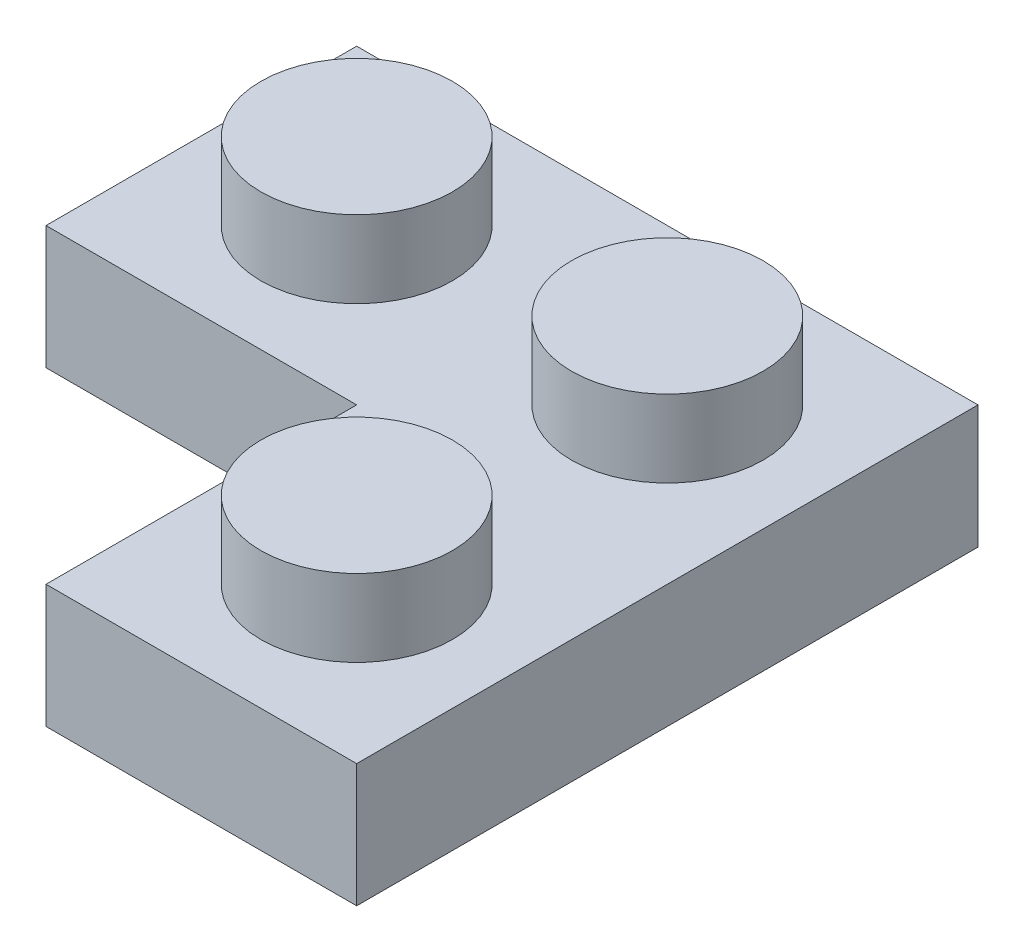
ISO-10303-21;
HEADER;
FILE_DESCRIPTION(('STEP AP214'),'2;1');
FILE_NAME('part.step','',(''),(''),'','','');
FILE_SCHEMA(('AUTOMOTIVE_DESIGN { 1 0 10303 214 1 1 1 1 }'));
ENDSEC;
DATA;
#1=APPLICATION_CONTEXT('core data for automotive mechanical design processes');
#2=APPLICATION_PROTOCOL_DEFINITION('international standard','automotive_design',2000,#1);
#3=PRODUCT_CONTEXT('',#1,'mechanical');
#4=PRODUCT('Part','Part','',(#3));
#5=PRODUCT_RELATED_PRODUCT_CATEGORY('part','',(#4));
#6=PRODUCT_DEFINITION_FORMATION('','',#4);
#7=PRODUCT_DEFINITION_CONTEXT('part definition',#1,'design');
#8=PRODUCT_DEFINITION('design','',#6,#7);
#9=PRODUCT_DEFINITION_SHAPE('','',#8);
#10=(LENGTH_UNIT() NAMED_UNIT(*) SI_UNIT(.MILLI.,.METRE.));
#11=(NAMED_UNIT(*) PLANE_ANGLE_UNIT() SI_UNIT($,.RADIAN.));
#12=(NAMED_UNIT(*) SI_UNIT($,.STERADIAN.) SOLID_ANGLE_UNIT());
#13=UNCERTAINTY_MEASURE_WITH_UNIT(LENGTH_MEASURE(1.E-05),#10,'distance_accuracy_value','');
#14=(GEOMETRIC_REPRESENTATION_CONTEXT(3) GLOBAL_UNCERTAINTY_ASSIGNED_CONTEXT((#13)) GLOBAL_UNIT_ASSIGNED_CONTEXT((#10,
#11,#12)) REPRESENTATION_CONTEXT('',''));
#15=CARTESIAN_POINT('',(0.,0.,0.));
#16=DIRECTION('',(0.,0.,1.));
#17=DIRECTION('',(1.,0.,0.));
#18=AXIS2_PLACEMENT_3D('',#15,#16,#17);
#19=CARTESIAN_POINT('',(0.,-3.15,0.));
#20=DIRECTION('',(0.,-1.,0.));
#21=DIRECTION('',(0.,0.,-1.));
#22=AXIS2_PLACEMENT_3D('',#19,#20,#21);
#23=PLANE('',#22);
#24=DIRECTION('',(1.,0.,0.));
#25=VECTOR('',#24,1.);
#26=CARTESIAN_POINT('',(-7.945,-3.15,0.));
#27=LINE('',#26,#25);
#28=CARTESIAN_POINT('',(-7.945,-3.15,0.));
#29=VERTEX_POINT('',#28);
#30=CARTESIAN_POINT('',(0.,-3.15,0.));
#31=VERTEX_POINT('',#30);
#32=EDGE_CURVE('E152',#29,#31,#27,.T.);
#33=ORIENTED_EDGE('',*,*,#32,.F.);
#34=DIRECTION('',(0.,0.,1.));
#35=VECTOR('',#34,1.);
#36=CARTESIAN_POINT('',(-7.945,-3.15,-7.945));
#37=LINE('',#36,#35);
#38=CARTESIAN_POINT('',(-7.945,-3.15,-7.945));
#39=VERTEX_POINT('',#38);
#40=EDGE_CURVE('E126',#39,#29,#37,.T.);
#41=ORIENTED_EDGE('',*,*,#40,.F.);
#42=DIRECTION('',(-1.,0.,0.));
#43=VECTOR('',#42,1.);
#44=CARTESIAN_POINT('',(7.945,-3.15,-7.945));
#45=LINE('',#44,#43);
#46=CARTESIAN_POINT('',(7.945,-3.15,-7.945));
#47=VERTEX_POINT('',#46);
#48=EDGE_CURVE('E109',#47,#39,#45,.T.);
#49=ORIENTED_EDGE('',*,*,#48,.F.);
#50=DIRECTION('',(0.,0.,-1.));
#51=VECTOR('',#50,1.);
#52=CARTESIAN_POINT('',(7.945,-3.15,7.945));
#53=LINE('',#52,#51);
#54=CARTESIAN_POINT('',(7.945,-3.15,7.945));
#55=VERTEX_POINT('',#54);
#56=EDGE_CURVE('E124',#55,#47,#53,.T.);
#57=ORIENTED_EDGE('',*,*,#56,.F.);
#58=DIRECTION('',(1.,0.,0.));
#59=VECTOR('',#58,1.);
#60=CARTESIAN_POINT('',(0.,-3.15,7.945));
#61=LINE('',#60,#59);
#62=CARTESIAN_POINT('',(0.,-3.15,7.945));
#63=VERTEX_POINT('',#62);
#64=EDGE_CURVE('E129',#63,#55,#61,.T.);
#65=ORIENTED_EDGE('',*,*,#64,.F.);
#66=DIRECTION('',(0.,0.,1.));
#67=VECTOR('',#66,1.);
#68=CARTESIAN_POINT('',(0.,-3.15,0.));
#69=LINE('',#68,#67);
#70=EDGE_CURVE('E131',#31,#63,#69,.T.);
#71=ORIENTED_EDGE('',*,*,#70,.F.);
#72=EDGE_LOOP('',(#33,#41,#49,#57,#65,#71));
#73=FACE_BOUND('',#72,.T.);
#74=DIRECTION('',(0.,0.,1.));
#75=VECTOR('',#74,1.);
#76=CARTESIAN_POINT('',(-6.395,-3.15,-7.945));
#77=LINE('',#76,#75);
#78=CARTESIAN_POINT('',(-6.395,-3.15,-6.395));
#79=VERTEX_POINT('',#78);
#80=CARTESIAN_POINT('',(-6.395,-3.15,-1.55));
#81=VERTEX_POINT('',#80);
#82=EDGE_CURVE('E249',#79,#81,#77,.T.);
#83=ORIENTED_EDGE('',*,*,#82,.T.);
#84=DIRECTION('',(1.,0.,0.));
#85=VECTOR('',#84,1.);
#86=CARTESIAN_POINT('',(-7.945,-3.15,-1.55));
#87=LINE('',#86,#85);
#88=CARTESIAN_POINT('',(1.55,-3.15,-1.55));
#89=VERTEX_POINT('',#88);
#90=EDGE_CURVE('E241',#81,#89,#87,.T.);
#91=ORIENTED_EDGE('',*,*,#90,.T.);
#92=DIRECTION('',(0.,0.,1.));
#93=VECTOR('',#92,1.);
#94=CARTESIAN_POINT('',(1.55,-3.15,0.));
#95=LINE('',#94,#93);
#96=CARTESIAN_POINT('',(1.55,-3.15,6.395));
#97=VERTEX_POINT('',#96);
#98=EDGE_CURVE('E238',#89,#97,#95,.T.);
#99=ORIENTED_EDGE('',*,*,#98,.T.);
#100=DIRECTION('',(1.,0.,0.));
#101=VECTOR('',#100,1.);
#102=CARTESIAN_POINT('',(0.,-3.15,6.395));
#103=LINE('',#102,#101);
#104=CARTESIAN_POINT('',(6.395,-3.15,6.395));
#105=VERTEX_POINT('',#104);
#106=EDGE_CURVE('E50',#97,#105,#103,.T.);
#107=ORIENTED_EDGE('',*,*,#106,.T.);
#108=DIRECTION('',(0.,0.,-1.));
#109=VECTOR('',#108,1.);
#110=CARTESIAN_POINT('',(6.395,-3.15,7.945));
#111=LINE('',#110,#109);
#112=CARTESIAN_POINT('',(6.395,-3.15,-6.395));
#113=VERTEX_POINT('',#112);
#114=EDGE_CURVE('E243',#105,#113,#111,.T.);
#115=ORIENTED_EDGE('',*,*,#114,.T.);
#116=DIRECTION('',(-1.,0.,0.));
#117=VECTOR('',#116,1.);
#118=CARTESIAN_POINT('',(7.945,-3.15,-6.395));
#119=LINE('',#118,#117);
#120=EDGE_CURVE('E246',#113,#79,#119,.T.);
#121=ORIENTED_EDGE('',*,*,#120,.T.);
#122=EDGE_LOOP('',(#83,#91,#99,#107,#115,#121));
#123=FACE_BOUND('',#122,.T.);
#124=ADVANCED_FACE('F35',(#73,#123),#23,.T.);
#125=CARTESIAN_POINT('',(-7.945,-3.15,0.));
#126=DIRECTION('',(0.,0.,1.));
#127=DIRECTION('',(1.,0.,0.));
#128=AXIS2_PLACEMENT_3D('',#125,#126,#127);
#129=PLANE('',#128);
#130=DIRECTION('',(1.,0.,0.));
#131=VECTOR('',#130,1.);
#132=CARTESIAN_POINT('',(-7.945,0.,0.));
#133=LINE('',#132,#131);
#134=CARTESIAN_POINT('',(-7.945,0.,0.));
#135=VERTEX_POINT('',#134);
#136=CARTESIAN_POINT('',(0.,0.,0.));
#137=VERTEX_POINT('',#136);
#138=EDGE_CURVE('E136',#135,#137,#133,.T.);
#139=ORIENTED_EDGE('',*,*,#138,.F.);
#140=DIRECTION('',(0.,1.,0.));
#141=VECTOR('',#140,1.);
#142=CARTESIAN_POINT('',(-7.945,-3.15,0.));
#143=LINE('',#142,#141);
#144=EDGE_CURVE('E59',#29,#135,#143,.T.);
#145=ORIENTED_EDGE('',*,*,#144,.F.);
#146=ORIENTED_EDGE('',*,*,#32,.T.);
#147=DIRECTION('',(0.,1.,0.));
#148=VECTOR('',#147,1.);
#149=CARTESIAN_POINT('',(0.,-3.15,0.));
#150=LINE('',#149,#148);
#151=EDGE_CURVE('E92',#31,#137,#150,.T.);
#152=ORIENTED_EDGE('',*,*,#151,.T.);
#153=EDGE_LOOP('',(#139,#145,#146,#152));
#154=FACE_BOUND('',#153,.T.);
#155=ADVANCED_FACE('F37',(#154),#129,.T.);
#156=CARTESIAN_POINT('',(-7.945,-3.15,-7.945));
#157=DIRECTION('',(-1.,0.,0.));
#158=DIRECTION('',(0.,0.,1.));
#159=AXIS2_PLACEMENT_3D('',#156,#157,#158);
#160=PLANE('',#159);
#161=DIRECTION('',(0.,0.,1.));
#162=VECTOR('',#161,1.);
#163=CARTESIAN_POINT('',(-7.945,0.,-7.945));
#164=LINE('',#163,#162);
#165=CARTESIAN_POINT('',(-7.945,0.,-7.945));
#166=VERTEX_POINT('',#165);
#167=EDGE_CURVE('E149',#166,#135,#164,.T.);
#168=ORIENTED_EDGE('',*,*,#167,.F.);
#169=DIRECTION('',(0.,1.,0.));
#170=VECTOR('',#169,1.);
#171=CARTESIAN_POINT('',(-7.945,-3.15,-7.945));
#172=LINE('',#171,#170);
#173=EDGE_CURVE('E117',#39,#166,#172,.T.);
#174=ORIENTED_EDGE('',*,*,#173,.F.);
#175=ORIENTED_EDGE('',*,*,#40,.T.);
#176=ORIENTED_EDGE('',*,*,#144,.T.);
#177=EDGE_LOOP('',(#168,#174,#175,#176));
#178=FACE_BOUND('',#177,.T.);
#179=ADVANCED_FACE('F203',(#178),#160,.T.);
#180=CARTESIAN_POINT('',(7.945,-3.15,-7.945));
#181=DIRECTION('',(0.,0.,-1.));
#182=DIRECTION('',(-1.,0.,0.));
#183=AXIS2_PLACEMENT_3D('',#180,#181,#182);
#184=PLANE('',#183);
#185=DIRECTION('',(-1.,0.,0.));
#186=VECTOR('',#185,1.);
#187=CARTESIAN_POINT('',(7.945,0.,-7.945));
#188=LINE('',#187,#186);
#189=CARTESIAN_POINT('',(7.945,0.,-7.945));
#190=VERTEX_POINT('',#189);
#191=EDGE_CURVE('E112',#190,#166,#188,.T.);
#192=ORIENTED_EDGE('',*,*,#191,.F.);
#193=DIRECTION('',(0.,1.,0.));
#194=VECTOR('',#193,1.);
#195=CARTESIAN_POINT('',(7.945,-3.15,-7.945));
#196=LINE('',#195,#194);
#197=EDGE_CURVE('E106',#47,#190,#196,.T.);
#198=ORIENTED_EDGE('',*,*,#197,.F.);
#199=ORIENTED_EDGE('',*,*,#48,.T.);
#200=ORIENTED_EDGE('',*,*,#173,.T.);
#201=EDGE_LOOP('',(#192,#198,#199,#200));
#202=FACE_BOUND('',#201,.T.);
#203=ADVANCED_FACE('F108',(#202),#184,.T.);
#204=CARTESIAN_POINT('',(7.945,-3.15,7.945));
#205=DIRECTION('',(1.,0.,0.));
#206=DIRECTION('',(0.,0.,-1.));
#207=AXIS2_PLACEMENT_3D('',#204,#205,#206);
#208=PLANE('',#207);
#209=DIRECTION('',(0.,0.,-1.));
#210=VECTOR('',#209,1.);
#211=CARTESIAN_POINT('',(7.945,0.,7.945));
#212=LINE('',#211,#210);
#213=CARTESIAN_POINT('',(7.945,0.,7.945));
#214=VERTEX_POINT('',#213);
#215=EDGE_CURVE('E146',#214,#190,#212,.T.);
#216=ORIENTED_EDGE('',*,*,#215,.F.);
#217=DIRECTION('',(0.,1.,0.));
#218=VECTOR('',#217,1.);
#219=CARTESIAN_POINT('',(7.945,-3.15,7.945));
#220=LINE('',#219,#218);
#221=EDGE_CURVE('E118',#55,#214,#220,.T.);
#222=ORIENTED_EDGE('',*,*,#221,.F.);
#223=ORIENTED_EDGE('',*,*,#56,.T.);
#224=ORIENTED_EDGE('',*,*,#197,.T.);
#225=EDGE_LOOP('',(#216,#222,#223,#224));
#226=FACE_BOUND('',#225,.T.);
#227=ADVANCED_FACE('F128',(#226),#208,.T.);
#228=CARTESIAN_POINT('',(0.,-3.15,7.945));
#229=DIRECTION('',(0.,0.,1.));
#230=DIRECTION('',(1.,0.,0.));
#231=AXIS2_PLACEMENT_3D('',#228,#229,#230);
#232=PLANE('',#231);
#233=DIRECTION('',(1.,0.,0.));
#234=VECTOR('',#233,1.);
#235=CARTESIAN_POINT('',(0.,0.,7.945));
#236=LINE('',#235,#234);
#237=CARTESIAN_POINT('',(0.,0.,7.945));
#238=VERTEX_POINT('',#237);
#239=EDGE_CURVE('E143',#238,#214,#236,.T.);
#240=ORIENTED_EDGE('',*,*,#239,.F.);
#241=DIRECTION('',(0.,1.,0.));
#242=VECTOR('',#241,1.);
#243=CARTESIAN_POINT('',(0.,-3.15,7.945));
#244=LINE('',#243,#242);
#245=EDGE_CURVE('E157',#63,#238,#244,.T.);
#246=ORIENTED_EDGE('',*,*,#245,.F.);
#247=ORIENTED_EDGE('',*,*,#64,.T.);
#248=ORIENTED_EDGE('',*,*,#221,.T.);
#249=EDGE_LOOP('',(#240,#246,#247,#248));
#250=FACE_BOUND('',#249,.T.);
#251=ADVANCED_FACE('F219',(#250),#232,.T.);
#252=CARTESIAN_POINT('',(0.,-3.15,0.));
#253=DIRECTION('',(-1.,0.,0.));
#254=DIRECTION('',(0.,0.,1.));
#255=AXIS2_PLACEMENT_3D('',#252,#253,#254);
#256=PLANE('',#255);
#257=DIRECTION('',(0.,0.,1.));
#258=VECTOR('',#257,1.);
#259=CARTESIAN_POINT('',(0.,0.,0.));
#260=LINE('',#259,#258);
#261=EDGE_CURVE('E139',#137,#238,#260,.T.);
#262=ORIENTED_EDGE('',*,*,#261,.F.);
#263=ORIENTED_EDGE('',*,*,#151,.F.);
#264=ORIENTED_EDGE('',*,*,#70,.T.);
#265=ORIENTED_EDGE('',*,*,#245,.T.);
#266=EDGE_LOOP('',(#262,#263,#264,#265));
#267=FACE_BOUND('',#266,.T.);
#268=ADVANCED_FACE('F211',(#267),#256,.T.);
#269=CARTESIAN_POINT('',(0.,0.,0.));
#270=DIRECTION('',(0.,-1.,0.));
#271=DIRECTION('',(0.,0.,-1.));
#272=AXIS2_PLACEMENT_3D('',#269,#270,#271);
#273=PLANE('',#272);
#274=CARTESIAN_POINT('',(-3.9725,0.,-3.9725));
#275=DIRECTION('',(0.,-1.,0.));
#276=DIRECTION('',(0.,0.,-1.));
#277=AXIS2_PLACEMENT_3D('',#274,#275,#276);
#278=CIRCLE('',#277,2.45);
#279=CARTESIAN_POINT('',(-3.9725,0.,-6.4225));
#280=VERTEX_POINT('',#279);
#281=EDGE_CURVE('E165',#280,#280,#278,.F.);
#282=ORIENTED_EDGE('',*,*,#281,.F.);
#283=EDGE_LOOP('',(#282));
#284=FACE_BOUND('',#283,.T.);
#285=CARTESIAN_POINT('',(3.9725,0.,3.9725));
#286=DIRECTION('',(0.,-1.,0.));
#287=DIRECTION('',(0.,0.,-1.));
#288=AXIS2_PLACEMENT_3D('',#285,#286,#287);
#289=CIRCLE('',#288,2.45);
#290=CARTESIAN_POINT('',(3.9725,0.,1.5225));
#291=VERTEX_POINT('',#290);
#292=EDGE_CURVE('E162',#291,#291,#289,.F.);
#293=ORIENTED_EDGE('',*,*,#292,.F.);
#294=EDGE_LOOP('',(#293));
#295=FACE_BOUND('',#294,.T.);
#296=CARTESIAN_POINT('',(3.9725,0.,-3.9725));
#297=DIRECTION('',(0.,-1.,0.));
#298=DIRECTION('',(0.,0.,-1.));
#299=AXIS2_PLACEMENT_3D('',#296,#297,#298);
#300=CIRCLE('',#299,2.45);
#301=CARTESIAN_POINT('',(3.9725,0.,-6.4225));
#302=VERTEX_POINT('',#301);
#303=EDGE_CURVE('E154',#302,#302,#300,.F.);
#304=ORIENTED_EDGE('',*,*,#303,.F.);
#305=EDGE_LOOP('',(#304));
#306=FACE_BOUND('',#305,.T.);
#307=ORIENTED_EDGE('',*,*,#138,.T.);
#308=ORIENTED_EDGE('',*,*,#261,.T.);
#309=ORIENTED_EDGE('',*,*,#239,.T.);
#310=ORIENTED_EDGE('',*,*,#215,.T.);
#311=ORIENTED_EDGE('',*,*,#191,.T.);
#312=ORIENTED_EDGE('',*,*,#167,.T.);
#313=EDGE_LOOP('',(#307,#308,#309,#310,#311,#312));
#314=FACE_BOUND('',#313,.T.);
#315=ADVANCED_FACE('F208',(#284,#295,#306,#314),#273,.F.);
#316=CARTESIAN_POINT('',(3.9725,1.97,-3.9725));
#317=DIRECTION('',(0.,-1.,0.));
#318=DIRECTION('',(0.,0.,-1.));
#319=AXIS2_PLACEMENT_3D('',#316,#317,#318);
#320=CYLINDRICAL_SURFACE('',#319,2.45);
#321=CARTESIAN_POINT('',(3.9725,1.97,-3.9725));
#322=DIRECTION('',(0.,1.,0.));
#323=DIRECTION('',(0.,0.,1.));
#324=AXIS2_PLACEMENT_3D('',#321,#322,#323);
#325=CIRCLE('',#324,2.45);
#326=CARTESIAN_POINT('',(3.9725,1.97,-1.5225));
#327=VERTEX_POINT('',#326);
#328=EDGE_CURVE('E140',#327,#327,#325,.T.);
#329=ORIENTED_EDGE('',*,*,#328,.F.);
#330=EDGE_LOOP('',(#329));
#331=FACE_BOUND('',#330,.T.);
#332=ORIENTED_EDGE('',*,*,#303,.T.);
#333=EDGE_LOOP('',(#332));
#334=FACE_BOUND('',#333,.T.);
#335=ADVANCED_FACE('F206',(#331,#334),#320,.T.);
#336=CARTESIAN_POINT('',(3.9725,1.97,-3.9725));
#337=DIRECTION('',(0.,1.,0.));
#338=DIRECTION('',(0.,0.,1.));
#339=AXIS2_PLACEMENT_3D('',#336,#337,#338);
#340=PLANE('',#339);
#341=ORIENTED_EDGE('',*,*,#328,.T.);
#342=EDGE_LOOP('',(#341));
#343=FACE_BOUND('',#342,.T.);
#344=ADVANCED_FACE('F574',(#343),#340,.T.);
#345=CARTESIAN_POINT('',(3.9725,1.97,3.9725));
#346=DIRECTION('',(0.,-1.,0.));
#347=DIRECTION('',(0.,0.,-1.));
#348=AXIS2_PLACEMENT_3D('',#345,#346,#347);
#349=CYLINDRICAL_SURFACE('',#348,2.45);
#350=CARTESIAN_POINT('',(3.9725,1.97,3.9725));
#351=DIRECTION('',(0.,1.,0.));
#352=DIRECTION('',(0.,0.,1.));
#353=AXIS2_PLACEMENT_3D('',#350,#351,#352);
#354=CIRCLE('',#353,2.45);
#355=CARTESIAN_POINT('',(3.9725,1.97,6.4225));
#356=VERTEX_POINT('',#355);
#357=EDGE_CURVE('E231',#356,#356,#354,.T.);
#358=ORIENTED_EDGE('',*,*,#357,.F.);
#359=EDGE_LOOP('',(#358));
#360=FACE_BOUND('',#359,.T.);
#361=ORIENTED_EDGE('',*,*,#292,.T.);
#362=EDGE_LOOP('',(#361));
#363=FACE_BOUND('',#362,.T.);
#364=ADVANCED_FACE('F565',(#360,#363),#349,.T.);
#365=CARTESIAN_POINT('',(3.9725,1.97,3.9725));
#366=DIRECTION('',(0.,1.,0.));
#367=DIRECTION('',(0.,0.,1.));
#368=AXIS2_PLACEMENT_3D('',#365,#366,#367);
#369=PLANE('',#368);
#370=ORIENTED_EDGE('',*,*,#357,.T.);
#371=EDGE_LOOP('',(#370));
#372=FACE_BOUND('',#371,.T.);
#373=ADVANCED_FACE('F556',(#372),#369,.T.);
#374=CARTESIAN_POINT('',(-3.9725,1.97,-3.9725));
#375=DIRECTION('',(0.,-1.,0.));
#376=DIRECTION('',(0.,0.,-1.));
#377=AXIS2_PLACEMENT_3D('',#374,#375,#376);
#378=CYLINDRICAL_SURFACE('',#377,2.45);
#379=CARTESIAN_POINT('',(-3.9725,1.97,-3.9725));
#380=DIRECTION('',(0.,1.,0.));
#381=DIRECTION('',(0.,0.,1.));
#382=AXIS2_PLACEMENT_3D('',#379,#380,#381);
#383=CIRCLE('',#382,2.45);
#384=CARTESIAN_POINT('',(-3.9725,1.97,-1.5225));
#385=VERTEX_POINT('',#384);
#386=EDGE_CURVE('E234',#385,#385,#383,.T.);
#387=ORIENTED_EDGE('',*,*,#386,.F.);
#388=EDGE_LOOP('',(#387));
#389=FACE_BOUND('',#388,.T.);
#390=ORIENTED_EDGE('',*,*,#281,.T.);
#391=EDGE_LOOP('',(#390));
#392=FACE_BOUND('',#391,.T.);
#393=ADVANCED_FACE('F547',(#389,#392),#378,.T.);
#394=CARTESIAN_POINT('',(-3.9725,1.97,-3.9725));
#395=DIRECTION('',(0.,1.,0.));
#396=DIRECTION('',(0.,0.,1.));
#397=AXIS2_PLACEMENT_3D('',#394,#395,#396);
#398=PLANE('',#397);
#399=ORIENTED_EDGE('',*,*,#386,.T.);
#400=EDGE_LOOP('',(#399));
#401=FACE_BOUND('',#400,.T.);
#402=ADVANCED_FACE('F347',(#401),#398,.T.);
#403=CARTESIAN_POINT('',(-7.945,-3.15,-1.55));
#404=DIRECTION('',(0.,0.,1.));
#405=DIRECTION('',(1.,0.,0.));
#406=AXIS2_PLACEMENT_3D('',#403,#404,#405);
#407=PLANE('',#406);
#408=DIRECTION('',(1.,0.,0.));
#409=VECTOR('',#408,1.);
#410=CARTESIAN_POINT('',(-7.945,-1.55,-1.55));
#411=LINE('',#410,#409);
#412=CARTESIAN_POINT('',(-6.395,-1.55,-1.55));
#413=VERTEX_POINT('',#412);
#414=CARTESIAN_POINT('',(1.55,-1.55,-1.55));
#415=VERTEX_POINT('',#414);
#416=EDGE_CURVE('E266',#413,#415,#411,.T.);
#417=ORIENTED_EDGE('',*,*,#416,.T.);
#418=DIRECTION('',(0.,1.,0.));
#419=VECTOR('',#418,1.);
#420=CARTESIAN_POINT('',(1.55,-3.15,-1.55));
#421=LINE('',#420,#419);
#422=EDGE_CURVE('E252',#89,#415,#421,.T.);
#423=ORIENTED_EDGE('',*,*,#422,.F.);
#424=ORIENTED_EDGE('',*,*,#90,.F.);
#425=DIRECTION('',(0.,1.,0.));
#426=VECTOR('',#425,1.);
#427=CARTESIAN_POINT('',(-6.395,-3.15,-1.55));
#428=LINE('',#427,#426);
#429=EDGE_CURVE('E271',#81,#413,#428,.T.);
#430=ORIENTED_EDGE('',*,*,#429,.T.);
#431=EDGE_LOOP('',(#417,#423,#424,#430));
#432=FACE_BOUND('',#431,.T.);
#433=ADVANCED_FACE('F343',(#432),#407,.F.);
#434=CARTESIAN_POINT('',(-6.395,-3.15,-7.945));
#435=DIRECTION('',(-1.,0.,0.));
#436=DIRECTION('',(0.,0.,1.));
#437=AXIS2_PLACEMENT_3D('',#434,#435,#436);
#438=PLANE('',#437);
#439=DIRECTION('',(0.,0.,1.));
#440=VECTOR('',#439,1.);
#441=CARTESIAN_POINT('',(-6.395,-1.55,-7.945));
#442=LINE('',#441,#440);
#443=CARTESIAN_POINT('',(-6.395,-1.55,-6.395));
#444=VERTEX_POINT('',#443);
#445=EDGE_CURVE('E255',#444,#413,#442,.T.);
#446=ORIENTED_EDGE('',*,*,#445,.T.);
#447=ORIENTED_EDGE('',*,*,#429,.F.);
#448=ORIENTED_EDGE('',*,*,#82,.F.);
#449=DIRECTION('',(0.,1.,0.));
#450=VECTOR('',#449,1.);
#451=CARTESIAN_POINT('',(-6.395,-3.15,-6.395));
#452=LINE('',#451,#450);
#453=EDGE_CURVE('E294',#79,#444,#452,.T.);
#454=ORIENTED_EDGE('',*,*,#453,.T.);
#455=EDGE_LOOP('',(#446,#447,#448,#454));
#456=FACE_BOUND('',#455,.T.);
#457=ADVANCED_FACE('F346',(#456),#438,.F.);
#458=CARTESIAN_POINT('',(7.945,-3.15,-6.395));
#459=DIRECTION('',(0.,0.,-1.));
#460=DIRECTION('',(-1.,0.,0.));
#461=AXIS2_PLACEMENT_3D('',#458,#459,#460);
#462=PLANE('',#461);
#463=DIRECTION('',(-1.,0.,0.));
#464=VECTOR('',#463,1.);
#465=CARTESIAN_POINT('',(7.945,-1.55,-6.395));
#466=LINE('',#465,#464);
#467=CARTESIAN_POINT('',(6.395,-1.55,-6.395));
#468=VERTEX_POINT('',#467);
#469=EDGE_CURVE('E291',#468,#444,#466,.T.);
#470=ORIENTED_EDGE('',*,*,#469,.T.);
#471=ORIENTED_EDGE('',*,*,#453,.F.);
#472=ORIENTED_EDGE('',*,*,#120,.F.);
#473=DIRECTION('',(0.,1.,0.));
#474=VECTOR('',#473,1.);
#475=CARTESIAN_POINT('',(6.395,-3.15,-6.395));
#476=LINE('',#475,#474);
#477=EDGE_CURVE('E288',#113,#468,#476,.T.);
#478=ORIENTED_EDGE('',*,*,#477,.T.);
#479=EDGE_LOOP('',(#470,#471,#472,#478));
#480=FACE_BOUND('',#479,.T.);
#481=ADVANCED_FACE('F351',(#480),#462,.F.);
#482=CARTESIAN_POINT('',(6.395,-3.15,7.945));
#483=DIRECTION('',(1.,0.,0.));
#484=DIRECTION('',(0.,0.,-1.));
#485=AXIS2_PLACEMENT_3D('',#482,#483,#484);
#486=PLANE('',#485);
#487=DIRECTION('',(0.,0.,-1.));
#488=VECTOR('',#487,1.);
#489=CARTESIAN_POINT('',(6.395,-1.55,7.945));
#490=LINE('',#489,#488);
#491=CARTESIAN_POINT('',(6.395,-1.55,6.395));
#492=VERTEX_POINT('',#491);
#493=EDGE_CURVE('E285',#492,#468,#490,.T.);
#494=ORIENTED_EDGE('',*,*,#493,.T.);
#495=ORIENTED_EDGE('',*,*,#477,.F.);
#496=ORIENTED_EDGE('',*,*,#114,.F.);
#497=DIRECTION('',(0.,1.,0.));
#498=VECTOR('',#497,1.);
#499=CARTESIAN_POINT('',(6.395,-3.15,6.395));
#500=LINE('',#499,#498);
#501=EDGE_CURVE('E282',#105,#492,#500,.T.);
#502=ORIENTED_EDGE('',*,*,#501,.T.);
#503=EDGE_LOOP('',(#494,#495,#496,#502));
#504=FACE_BOUND('',#503,.T.);
#505=ADVANCED_FACE('F355',(#504),#486,.F.);
#506=CARTESIAN_POINT('',(0.,-3.15,6.395));
#507=DIRECTION('',(0.,0.,1.));
#508=DIRECTION('',(1.,0.,0.));
#509=AXIS2_PLACEMENT_3D('',#506,#507,#508);
#510=PLANE('',#509);
#511=DIRECTION('',(1.,0.,0.));
#512=VECTOR('',#511,1.);
#513=CARTESIAN_POINT('',(0.,-1.55,6.395));
#514=LINE('',#513,#512);
#515=CARTESIAN_POINT('',(1.55,-1.55,6.395));
#516=VERTEX_POINT('',#515);
#517=EDGE_CURVE('E279',#516,#492,#514,.T.);
#518=ORIENTED_EDGE('',*,*,#517,.T.);
#519=ORIENTED_EDGE('',*,*,#501,.F.);
#520=ORIENTED_EDGE('',*,*,#106,.F.);
#521=DIRECTION('',(0.,1.,0.));
#522=VECTOR('',#521,1.);
#523=CARTESIAN_POINT('',(1.55,-3.15,6.395));
#524=LINE('',#523,#522);
#525=EDGE_CURVE('E280',#97,#516,#524,.T.);
#526=ORIENTED_EDGE('',*,*,#525,.T.);
#527=EDGE_LOOP('',(#518,#519,#520,#526));
#528=FACE_BOUND('',#527,.T.);
#529=ADVANCED_FACE('F359',(#528),#510,.F.);
#530=CARTESIAN_POINT('',(1.55,-3.15,0.));
#531=DIRECTION('',(-1.,0.,0.));
#532=DIRECTION('',(0.,0.,1.));
#533=AXIS2_PLACEMENT_3D('',#530,#531,#532);
#534=PLANE('',#533);
#535=DIRECTION('',(0.,0.,1.));
#536=VECTOR('',#535,1.);
#537=CARTESIAN_POINT('',(1.55,-1.55,0.));
#538=LINE('',#537,#536);
#539=EDGE_CURVE('E276',#415,#516,#538,.T.);
#540=ORIENTED_EDGE('',*,*,#539,.T.);
#541=ORIENTED_EDGE('',*,*,#525,.F.);
#542=ORIENTED_EDGE('',*,*,#98,.F.);
#543=ORIENTED_EDGE('',*,*,#422,.T.);
#544=EDGE_LOOP('',(#540,#541,#542,#543));
#545=FACE_BOUND('',#544,.T.);
#546=ADVANCED_FACE('F193',(#545),#534,.F.);
#547=CARTESIAN_POINT('',(0.,-1.55,0.));
#548=DIRECTION('',(0.,-1.,0.));
#549=DIRECTION('',(0.,0.,-1.));
#550=AXIS2_PLACEMENT_3D('',#547,#548,#549);
#551=PLANE('',#550);
#552=CARTESIAN_POINT('',(3.97,-1.55,0.));
#553=DIRECTION('',(0.,-1.,0.));
#554=DIRECTION('',(0.,0.,-1.));
#555=AXIS2_PLACEMENT_3D('',#552,#553,#554);
#556=CIRCLE('',#555,1.48);
#557=CARTESIAN_POINT('',(3.97,-1.55,-1.48));
#558=VERTEX_POINT('',#557);
#559=EDGE_CURVE('E319',#558,#558,#556,.T.);
#560=ORIENTED_EDGE('',*,*,#559,.F.);
#561=EDGE_LOOP('',(#560));
#562=FACE_BOUND('',#561,.T.);
#563=CARTESIAN_POINT('',(0.,-1.55,-3.975));
#564=DIRECTION('',(0.,-1.,0.));
#565=DIRECTION('',(0.,0.,-1.));
#566=AXIS2_PLACEMENT_3D('',#563,#564,#565);
#567=CIRCLE('',#566,1.48);
#568=CARTESIAN_POINT('',(0.,-1.55,-5.455));
#569=VERTEX_POINT('',#568);
#570=EDGE_CURVE('E310',#569,#569,#567,.T.);
#571=ORIENTED_EDGE('',*,*,#570,.F.);
#572=EDGE_LOOP('',(#571));
#573=FACE_BOUND('',#572,.T.);
#574=CARTESIAN_POINT('',(-3.9725,-1.55,-3.9725));
#575=DIRECTION('',(0.,-1.,0.));
#576=DIRECTION('',(0.,0.,-1.));
#577=AXIS2_PLACEMENT_3D('',#574,#575,#576);
#578=CIRCLE('',#577,0.900000000000001);
#579=CARTESIAN_POINT('',(-3.9725,-1.55,-4.8725));
#580=VERTEX_POINT('',#579);
#581=EDGE_CURVE('E237',#580,#580,#578,.F.);
#582=ORIENTED_EDGE('',*,*,#581,.T.);
#583=EDGE_LOOP('',(#582));
#584=FACE_BOUND('',#583,.T.);
#585=CARTESIAN_POINT('',(3.9725,-1.55,3.9725));
#586=DIRECTION('',(0.,-1.,0.));
#587=DIRECTION('',(0.,0.,-1.));
#588=AXIS2_PLACEMENT_3D('',#585,#586,#587);
#589=CIRCLE('',#588,0.900000000000001);
#590=CARTESIAN_POINT('',(3.9725,-1.55,3.0725));
#591=VERTEX_POINT('',#590);
#592=EDGE_CURVE('E270',#591,#591,#589,.F.);
#593=ORIENTED_EDGE('',*,*,#592,.T.);
#594=EDGE_LOOP('',(#593));
#595=FACE_BOUND('',#594,.T.);
#596=CARTESIAN_POINT('',(3.9725,-1.55,-3.9725));
#597=DIRECTION('',(0.,-1.,0.));
#598=DIRECTION('',(0.,0.,-1.));
#599=AXIS2_PLACEMENT_3D('',#596,#597,#598);
#600=CIRCLE('',#599,0.900000000000002);
#601=CARTESIAN_POINT('',(3.9725,-1.55,-4.8725));
#602=VERTEX_POINT('',#601);
#603=EDGE_CURVE('E267',#602,#602,#600,.F.);
#604=ORIENTED_EDGE('',*,*,#603,.T.);
#605=EDGE_LOOP('',(#604));
#606=FACE_BOUND('',#605,.T.);
#607=ORIENTED_EDGE('',*,*,#416,.F.);
#608=ORIENTED_EDGE('',*,*,#445,.F.);
#609=ORIENTED_EDGE('',*,*,#469,.F.);
#610=ORIENTED_EDGE('',*,*,#493,.F.);
#611=ORIENTED_EDGE('',*,*,#517,.F.);
#612=ORIENTED_EDGE('',*,*,#539,.F.);
#613=EDGE_LOOP('',(#607,#608,#609,#610,#611,#612));
#614=FACE_BOUND('',#613,.T.);
#615=ADVANCED_FACE('F178',(#562,#573,#584,#595,#606,#614),#551,.T.);
#616=CARTESIAN_POINT('',(3.9725,1.97,-3.9725));
#617=DIRECTION('',(0.,-1.,0.));
#618=DIRECTION('',(0.,0.,-1.));
#619=AXIS2_PLACEMENT_3D('',#616,#617,#618);
#620=CYLINDRICAL_SURFACE('',#619,0.900000000000002);
#621=CARTESIAN_POINT('',(3.9725,0.42,-3.9725));
#622=DIRECTION('',(0.,1.,0.));
#623=DIRECTION('',(0.,0.,1.));
#624=AXIS2_PLACEMENT_3D('',#621,#622,#623);
#625=CIRCLE('',#624,0.900000000000002);
#626=CARTESIAN_POINT('',(3.9725,0.42,-3.0725));
#627=VERTEX_POINT('',#626);
#628=EDGE_CURVE('E263',#627,#627,#625,.T.);
#629=ORIENTED_EDGE('',*,*,#628,.T.);
#630=EDGE_LOOP('',(#629));
#631=FACE_BOUND('',#630,.T.);
#632=ORIENTED_EDGE('',*,*,#603,.F.);
#633=EDGE_LOOP('',(#632));
#634=FACE_BOUND('',#633,.T.);
#635=ADVANCED_FACE('F192',(#631,#634),#620,.F.);
#636=CARTESIAN_POINT('',(3.9725,0.42,-3.9725));
#637=DIRECTION('',(0.,1.,0.));
#638=DIRECTION('',(0.,0.,1.));
#639=AXIS2_PLACEMENT_3D('',#636,#637,#638);
#640=PLANE('',#639);
#641=ORIENTED_EDGE('',*,*,#628,.F.);
#642=EDGE_LOOP('',(#641));
#643=FACE_BOUND('',#642,.T.);
#644=ADVANCED_FACE('F414',(#643),#640,.F.);
#645=CARTESIAN_POINT('',(3.9725,1.97,3.9725));
#646=DIRECTION('',(0.,-1.,0.));
#647=DIRECTION('',(0.,0.,-1.));
#648=AXIS2_PLACEMENT_3D('',#645,#646,#647);
#649=CYLINDRICAL_SURFACE('',#648,0.900000000000001);
#650=CARTESIAN_POINT('',(3.9725,0.42,3.9725));
#651=DIRECTION('',(0.,1.,0.));
#652=DIRECTION('',(0.,0.,1.));
#653=AXIS2_PLACEMENT_3D('',#650,#651,#652);
#654=CIRCLE('',#653,0.900000000000001);
#655=CARTESIAN_POINT('',(3.9725,0.42,4.8725));
#656=VERTEX_POINT('',#655);
#657=EDGE_CURVE('E259',#656,#656,#654,.T.);
#658=ORIENTED_EDGE('',*,*,#657,.T.);
#659=EDGE_LOOP('',(#658));
#660=FACE_BOUND('',#659,.T.);
#661=ORIENTED_EDGE('',*,*,#592,.F.);
#662=EDGE_LOOP('',(#661));
#663=FACE_BOUND('',#662,.T.);
#664=ADVANCED_FACE('F421',(#660,#663),#649,.F.);
#665=CARTESIAN_POINT('',(3.9725,0.42,3.9725));
#666=DIRECTION('',(0.,1.,0.));
#667=DIRECTION('',(0.,0.,1.));
#668=AXIS2_PLACEMENT_3D('',#665,#666,#667);
#669=PLANE('',#668);
#670=ORIENTED_EDGE('',*,*,#657,.F.);
#671=EDGE_LOOP('',(#670));
#672=FACE_BOUND('',#671,.T.);
#673=ADVANCED_FACE('F429',(#672),#669,.F.);
#674=CARTESIAN_POINT('',(-3.9725,1.97,-3.9725));
#675=DIRECTION('',(0.,-1.,0.));
#676=DIRECTION('',(0.,0.,-1.));
#677=AXIS2_PLACEMENT_3D('',#674,#675,#676);
#678=CYLINDRICAL_SURFACE('',#677,0.900000000000001);
#679=CARTESIAN_POINT('',(-3.9725,0.42,-3.9725));
#680=DIRECTION('',(0.,1.,0.));
#681=DIRECTION('',(0.,0.,1.));
#682=AXIS2_PLACEMENT_3D('',#679,#680,#681);
#683=CIRCLE('',#682,0.900000000000001);
#684=CARTESIAN_POINT('',(-3.9725,0.42,-3.0725));
#685=VERTEX_POINT('',#684);
#686=EDGE_CURVE('E256',#685,#685,#683,.T.);
#687=ORIENTED_EDGE('',*,*,#686,.T.);
#688=EDGE_LOOP('',(#687));
#689=FACE_BOUND('',#688,.T.);
#690=ORIENTED_EDGE('',*,*,#581,.F.);
#691=EDGE_LOOP('',(#690));
#692=FACE_BOUND('',#691,.T.);
#693=ADVANCED_FACE('F437',(#689,#692),#678,.F.);
#694=CARTESIAN_POINT('',(-3.9725,0.42,-3.9725));
#695=DIRECTION('',(0.,1.,0.));
#696=DIRECTION('',(0.,0.,1.));
#697=AXIS2_PLACEMENT_3D('',#694,#695,#696);
#698=PLANE('',#697);
#699=ORIENTED_EDGE('',*,*,#686,.F.);
#700=EDGE_LOOP('',(#699));
#701=FACE_BOUND('',#700,.T.);
#702=ADVANCED_FACE('F341',(#701),#698,.F.);
#703=CARTESIAN_POINT('',(0.,-7.33607214462436,-3.975));
#704=DIRECTION('',(0.,1.,0.));
#705=DIRECTION('',(0.,0.,1.));
#706=AXIS2_PLACEMENT_3D('',#703,#704,#705);
#707=CYLINDRICAL_SURFACE('',#706,1.48);
#708=ORIENTED_EDGE('',*,*,#570,.T.);
#709=EDGE_LOOP('',(#708));
#710=FACE_BOUND('',#709,.T.);
#711=CARTESIAN_POINT('',(0.,-2.95,-3.975));
#712=DIRECTION('',(0.,-1.,0.));
#713=DIRECTION('',(0.,0.,-1.));
#714=AXIS2_PLACEMENT_3D('',#711,#712,#713);
#715=CIRCLE('',#714,1.48);
#716=CARTESIAN_POINT('',(0.,-2.95,-5.455));
#717=VERTEX_POINT('',#716);
#718=EDGE_CURVE('E260',#717,#717,#715,.T.);
#719=ORIENTED_EDGE('',*,*,#718,.F.);
#720=EDGE_LOOP('',(#719));
#721=FACE_BOUND('',#720,.T.);
#722=ADVANCED_FACE('F338',(#710,#721),#707,.T.);
#723=CARTESIAN_POINT('',(0.,-7.33607214462436,-3.975));
#724=DIRECTION('',(0.,1.,0.));
#725=DIRECTION('',(0.,0.,1.));
#726=AXIS2_PLACEMENT_3D('',#723,#724,#725);
#727=CYLINDRICAL_SURFACE('',#726,0.54);
#728=CARTESIAN_POINT('',(0.,-1.55,-3.975));
#729=DIRECTION('',(0.,-1.,0.));
#730=DIRECTION('',(0.,0.,-1.));
#731=AXIS2_PLACEMENT_3D('',#728,#729,#730);
#732=CIRCLE('',#731,0.54);
#733=CARTESIAN_POINT('',(0.,-1.55,-4.515));
#734=VERTEX_POINT('',#733);
#735=EDGE_CURVE('E43',#734,#734,#732,.F.);
#736=ORIENTED_EDGE('',*,*,#735,.T.);
#737=EDGE_LOOP('',(#736));
#738=FACE_BOUND('',#737,.T.);
#739=CARTESIAN_POINT('',(0.,-2.95,-3.975));
#740=DIRECTION('',(0.,-1.,0.));
#741=DIRECTION('',(0.,0.,-1.));
#742=AXIS2_PLACEMENT_3D('',#739,#740,#741);
#743=CIRCLE('',#742,0.54);
#744=CARTESIAN_POINT('',(0.,-2.95,-4.515));
#745=VERTEX_POINT('',#744);
#746=EDGE_CURVE('E307',#745,#745,#743,.T.);
#747=ORIENTED_EDGE('',*,*,#746,.T.);
#748=EDGE_LOOP('',(#747));
#749=FACE_BOUND('',#748,.T.);
#750=ADVANCED_FACE('F170',(#738,#749),#727,.F.);
#751=CARTESIAN_POINT('',(0.,-2.95,0.));
#752=DIRECTION('',(0.,-1.,0.));
#753=DIRECTION('',(0.,0.,-1.));
#754=AXIS2_PLACEMENT_3D('',#751,#752,#753);
#755=PLANE('',#754);
#756=ORIENTED_EDGE('',*,*,#746,.F.);
#757=EDGE_LOOP('',(#756));
#758=FACE_BOUND('',#757,.T.);
#759=ORIENTED_EDGE('',*,*,#718,.T.);
#760=EDGE_LOOP('',(#759));
#761=FACE_BOUND('',#760,.T.);
#762=ADVANCED_FACE('F176',(#758,#761),#755,.T.);
#763=ORIENTED_EDGE('',*,*,#735,.F.);
#764=EDGE_LOOP('',(#763));
#765=FACE_BOUND('',#764,.T.);
#766=ADVANCED_FACE('F173',(#765),#551,.T.);
#767=CARTESIAN_POINT('',(3.97,-7.33607214462436,0.));
#768=DIRECTION('',(0.,1.,0.));
#769=DIRECTION('',(0.,0.,1.));
#770=AXIS2_PLACEMENT_3D('',#767,#768,#769);
#771=CYLINDRICAL_SURFACE('',#770,1.48);
#772=ORIENTED_EDGE('',*,*,#559,.T.);
#773=EDGE_LOOP('',(#772));
#774=FACE_BOUND('',#773,.T.);
#775=CARTESIAN_POINT('',(3.97,-2.95,0.));
#776=DIRECTION('',(0.,-1.,0.));
#777=DIRECTION('',(0.,0.,-1.));
#778=AXIS2_PLACEMENT_3D('',#775,#776,#777);
#779=CIRCLE('',#778,1.48);
#780=CARTESIAN_POINT('',(3.97,-2.95,-1.48));
#781=VERTEX_POINT('',#780);
#782=EDGE_CURVE('E311',#781,#781,#779,.T.);
#783=ORIENTED_EDGE('',*,*,#782,.F.);
#784=EDGE_LOOP('',(#783));
#785=FACE_BOUND('',#784,.T.);
#786=ADVANCED_FACE('F175',(#774,#785),#771,.T.);
#787=CARTESIAN_POINT('',(3.97,-7.33607214462436,0.));
#788=DIRECTION('',(0.,1.,0.));
#789=DIRECTION('',(0.,0.,1.));
#790=AXIS2_PLACEMENT_3D('',#787,#788,#789);
#791=CYLINDRICAL_SURFACE('',#790,0.539999999999999);
#792=CARTESIAN_POINT('',(3.97,-1.55,0.));
#793=DIRECTION('',(0.,-1.,0.));
#794=DIRECTION('',(0.,0.,-1.));
#795=AXIS2_PLACEMENT_3D('',#792,#793,#794);
#796=CIRCLE('',#795,0.539999999999999);
#797=CARTESIAN_POINT('',(3.97,-1.55,-0.539999999999999));
#798=VERTEX_POINT('',#797);
#799=EDGE_CURVE('E12',#798,#798,#796,.F.);
#800=ORIENTED_EDGE('',*,*,#799,.T.);
#801=EDGE_LOOP('',(#800));
#802=FACE_BOUND('',#801,.T.);
#803=CARTESIAN_POINT('',(3.97,-2.95,0.));
#804=DIRECTION('',(0.,-1.,0.));
#805=DIRECTION('',(0.,0.,-1.));
#806=AXIS2_PLACEMENT_3D('',#803,#804,#805);
#807=CIRCLE('',#806,0.539999999999999);
#808=CARTESIAN_POINT('',(3.97,-2.95,-0.539999999999999));
#809=VERTEX_POINT('',#808);
#810=EDGE_CURVE('E316',#809,#809,#807,.T.);
#811=ORIENTED_EDGE('',*,*,#810,.T.);
#812=EDGE_LOOP('',(#811));
#813=FACE_BOUND('',#812,.T.);
#814=ADVANCED_FACE('F184',(#802,#813),#791,.F.);
#815=CARTESIAN_POINT('',(0.,-2.95,0.));
#816=DIRECTION('',(0.,-1.,0.));
#817=DIRECTION('',(0.,0.,-1.));
#818=AXIS2_PLACEMENT_3D('',#815,#816,#817);
#819=PLANE('',#818);
#820=ORIENTED_EDGE('',*,*,#810,.F.);
#821=EDGE_LOOP('',(#820));
#822=FACE_BOUND('',#821,.T.);
#823=ORIENTED_EDGE('',*,*,#782,.T.);
#824=EDGE_LOOP('',(#823));
#825=FACE_BOUND('',#824,.T.);
#826=ADVANCED_FACE('F196',(#822,#825),#819,.T.);
#827=ORIENTED_EDGE('',*,*,#799,.F.);
#828=EDGE_LOOP('',(#827));
#829=FACE_BOUND('',#828,.T.);
#830=ADVANCED_FACE('F179',(#829),#551,.T.);
#831=CLOSED_SHELL('',(#124,#155,#179,#203,#227,#251,#268,#315,#335,#344,#364,#373,#393,#402,
#433,#457,#481,#505,#529,#546,#615,#635,#644,#664,#673,#693,#702,#722,#750,#762,#766,#786,#814,
#826,#830));
#832=MANIFOLD_SOLID_BREP('B2',#831);
#833=ADVANCED_BREP_SHAPE_REPRESENTATION('',(#18,#832),#14);
#834=SHAPE_DEFINITION_REPRESENTATION(#9,#833);
ENDSEC;
END-ISO-10303-21;
